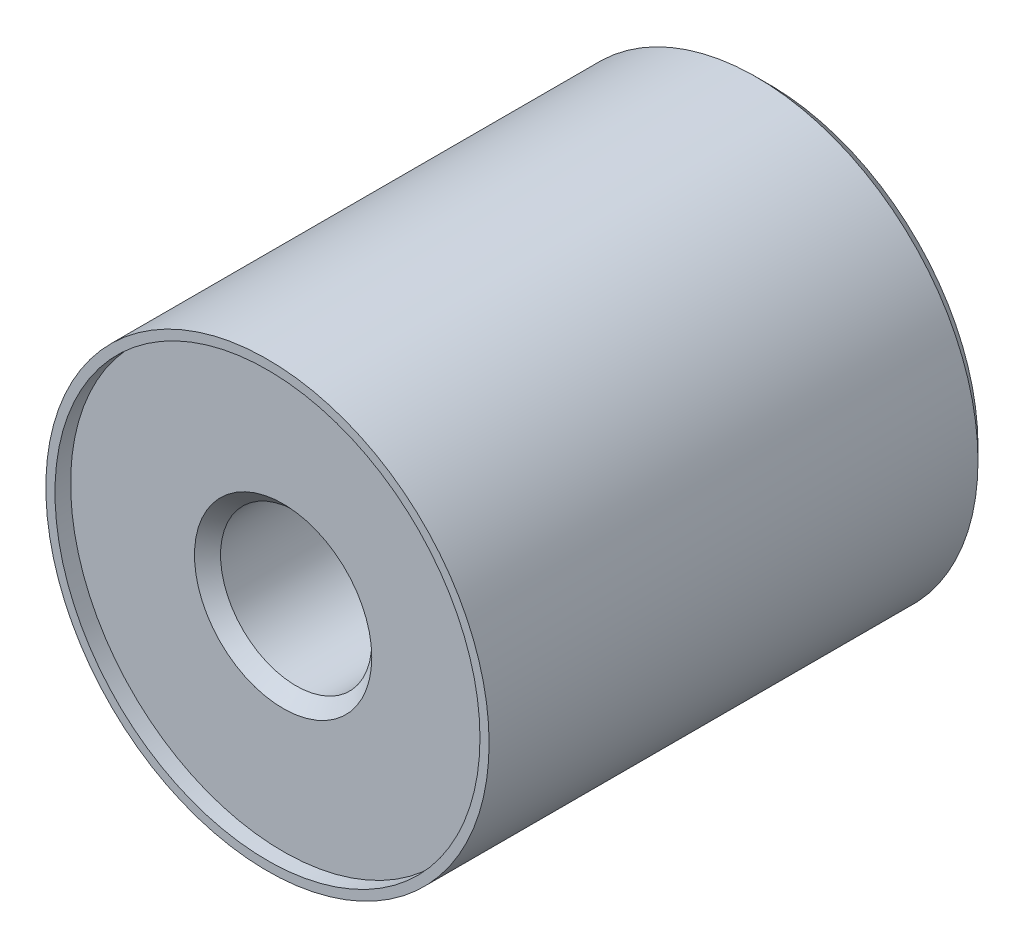
ISO-10303-21;
HEADER;
FILE_DESCRIPTION(('STEP AP214'),'2;1');
FILE_NAME('part.step','',(''),(''),'','','');
FILE_SCHEMA(('AUTOMOTIVE_DESIGN { 1 0 10303 214 1 1 1 1 }'));
ENDSEC;
DATA;
#1=APPLICATION_CONTEXT('core data for automotive mechanical design processes');
#2=APPLICATION_PROTOCOL_DEFINITION('international standard','automotive_design',2000,#1);
#3=PRODUCT_CONTEXT('',#1,'mechanical');
#4=PRODUCT('Part','Part','',(#3));
#5=PRODUCT_RELATED_PRODUCT_CATEGORY('part','',(#4));
#6=PRODUCT_DEFINITION_FORMATION('','',#4);
#7=PRODUCT_DEFINITION_CONTEXT('part definition',#1,'design');
#8=PRODUCT_DEFINITION('design','',#6,#7);
#9=PRODUCT_DEFINITION_SHAPE('','',#8);
#10=(LENGTH_UNIT() NAMED_UNIT(*) SI_UNIT(.MILLI.,.METRE.));
#11=(NAMED_UNIT(*) PLANE_ANGLE_UNIT() SI_UNIT($,.RADIAN.));
#12=(NAMED_UNIT(*) SI_UNIT($,.STERADIAN.) SOLID_ANGLE_UNIT());
#13=UNCERTAINTY_MEASURE_WITH_UNIT(LENGTH_MEASURE(1.E-05),#10,'distance_accuracy_value','');
#14=(GEOMETRIC_REPRESENTATION_CONTEXT(3) GLOBAL_UNCERTAINTY_ASSIGNED_CONTEXT((#13)) GLOBAL_UNIT_ASSIGNED_CONTEXT((#10,
#11,#12)) REPRESENTATION_CONTEXT('',''));
#15=CARTESIAN_POINT('',(0.,0.,0.));
#16=DIRECTION('',(0.,0.,1.));
#17=DIRECTION('',(1.,0.,0.));
#18=AXIS2_PLACEMENT_3D('',#15,#16,#17);
#19=CARTESIAN_POINT('',(0.,0.,18.65));
#20=DIRECTION('',(0.,0.,1.));
#21=DIRECTION('',(1.,0.,0.));
#22=AXIS2_PLACEMENT_3D('',#19,#20,#21);
#23=PLANE('',#22);
#24=CARTESIAN_POINT('',(0.,0.,18.65));
#25=DIRECTION('',(0.,0.,1.));
#26=DIRECTION('',(1.,0.,0.));
#27=AXIS2_PLACEMENT_3D('',#24,#25,#26);
#28=CIRCLE('',#27,3.4);
#29=CARTESIAN_POINT('',(3.4,0.,18.65));
#30=VERTEX_POINT('',#29);
#31=EDGE_CURVE('E10',#30,#30,#28,.F.);
#32=ORIENTED_EDGE('',*,*,#31,.T.);
#33=EDGE_LOOP('',(#32));
#34=FACE_BOUND('',#33,.T.);
#35=CARTESIAN_POINT('',(0.,0.,18.65));
#36=DIRECTION('',(0.,0.,1.));
#37=DIRECTION('',(1.,0.,0.));
#38=AXIS2_PLACEMENT_3D('',#35,#36,#37);
#39=CIRCLE('',#38,8.15);
#40=CARTESIAN_POINT('',(8.15,0.,18.65));
#41=VERTEX_POINT('',#40);
#42=EDGE_CURVE('E60',#41,#41,#39,.F.);
#43=ORIENTED_EDGE('',*,*,#42,.F.);
#44=EDGE_LOOP('',(#43));
#45=FACE_BOUND('',#44,.T.);
#46=ADVANCED_FACE('F33',(#34,#45),#23,.T.);
#47=CARTESIAN_POINT('',(0.,0.,0.));
#48=DIRECTION('',(0.,0.,1.));
#49=DIRECTION('',(1.,0.,0.));
#50=AXIS2_PLACEMENT_3D('',#47,#48,#49);
#51=PLANE('',#50);
#52=CARTESIAN_POINT('',(0.,0.,0.));
#53=DIRECTION('',(0.,0.,1.));
#54=DIRECTION('',(1.,0.,0.));
#55=AXIS2_PLACEMENT_3D('',#52,#53,#54);
#56=CIRCLE('',#55,3.4);
#57=CARTESIAN_POINT('',(3.4,0.,0.));
#58=VERTEX_POINT('',#57);
#59=EDGE_CURVE('E54',#58,#58,#56,.T.);
#60=ORIENTED_EDGE('',*,*,#59,.T.);
#61=EDGE_LOOP('',(#60));
#62=FACE_BOUND('',#61,.T.);
#63=CARTESIAN_POINT('',(0.,0.,0.));
#64=DIRECTION('',(0.,0.,1.));
#65=DIRECTION('',(1.,0.,0.));
#66=AXIS2_PLACEMENT_3D('',#63,#64,#65);
#67=CIRCLE('',#66,7.99999999999999);
#68=CARTESIAN_POINT('',(7.99999999999999,0.,0.));
#69=VERTEX_POINT('',#68);
#70=EDGE_CURVE('E57',#69,#69,#67,.F.);
#71=ORIENTED_EDGE('',*,*,#70,.T.);
#72=EDGE_LOOP('',(#71));
#73=FACE_BOUND('',#72,.T.);
#74=ADVANCED_FACE('F89',(#62,#73),#51,.F.);
#75=CARTESIAN_POINT('',(0.,0.,18.65));
#76=DIRECTION('',(0.,0.,-1.));
#77=DIRECTION('',(-1.,0.,0.));
#78=AXIS2_PLACEMENT_3D('',#75,#76,#77);
#79=CYLINDRICAL_SURFACE('',#78,8.5);
#80=CARTESIAN_POINT('',(0.,0.,0.500000000000004));
#81=DIRECTION('',(0.,0.,1.));
#82=DIRECTION('',(1.,0.,0.));
#83=AXIS2_PLACEMENT_3D('',#80,#81,#82);
#84=CIRCLE('',#83,8.5);
#85=CARTESIAN_POINT('',(8.5,0.,0.500000000000004));
#86=VERTEX_POINT('',#85);
#87=EDGE_CURVE('E41',#86,#86,#84,.T.);
#88=ORIENTED_EDGE('',*,*,#87,.T.);
#89=EDGE_LOOP('',(#88));
#90=FACE_BOUND('',#89,.T.);
#91=CARTESIAN_POINT('',(0.,0.,19.25));
#92=DIRECTION('',(0.,0.,1.));
#93=DIRECTION('',(1.,0.,0.));
#94=AXIS2_PLACEMENT_3D('',#91,#92,#93);
#95=CIRCLE('',#94,8.5);
#96=CARTESIAN_POINT('',(8.5,0.,19.25));
#97=VERTEX_POINT('',#96);
#98=EDGE_CURVE('E63',#97,#97,#95,.T.);
#99=ORIENTED_EDGE('',*,*,#98,.F.);
#100=EDGE_LOOP('',(#99));
#101=FACE_BOUND('',#100,.T.);
#102=ADVANCED_FACE('F85',(#90,#101),#79,.T.);
#103=CARTESIAN_POINT('',(0.,0.,18.65));
#104=DIRECTION('',(0.,0.,-1.));
#105=DIRECTION('',(-1.,0.,0.));
#106=AXIS2_PLACEMENT_3D('',#103,#104,#105);
#107=CYLINDRICAL_SURFACE('',#106,2.9);
#108=CARTESIAN_POINT('',(0.,0.,0.500000000000004));
#109=DIRECTION('',(0.,0.,1.));
#110=DIRECTION('',(1.,0.,0.));
#111=AXIS2_PLACEMENT_3D('',#108,#109,#110);
#112=CIRCLE('',#111,2.9);
#113=CARTESIAN_POINT('',(2.9,0.,0.500000000000004));
#114=VERTEX_POINT('',#113);
#115=EDGE_CURVE('E45',#114,#114,#112,.F.);
#116=ORIENTED_EDGE('',*,*,#115,.T.);
#117=EDGE_LOOP('',(#116));
#118=FACE_BOUND('',#117,.T.);
#119=CARTESIAN_POINT('',(0.,0.,18.15));
#120=DIRECTION('',(0.,0.,1.));
#121=DIRECTION('',(1.,0.,0.));
#122=AXIS2_PLACEMENT_3D('',#119,#120,#121);
#123=CIRCLE('',#122,2.9);
#124=CARTESIAN_POINT('',(2.9,0.,18.15));
#125=VERTEX_POINT('',#124);
#126=EDGE_CURVE('E49',#125,#125,#123,.T.);
#127=ORIENTED_EDGE('',*,*,#126,.T.);
#128=EDGE_LOOP('',(#127));
#129=FACE_BOUND('',#128,.T.);
#130=ADVANCED_FACE('F75',(#118,#129),#107,.F.);
#131=CARTESIAN_POINT('',(0.,0.,19.25));
#132=DIRECTION('',(0.,0.,1.));
#133=DIRECTION('',(1.,0.,0.));
#134=AXIS2_PLACEMENT_3D('',#131,#132,#133);
#135=PLANE('',#134);
#136=ORIENTED_EDGE('',*,*,#98,.T.);
#137=EDGE_LOOP('',(#136));
#138=FACE_BOUND('',#137,.T.);
#139=CARTESIAN_POINT('',(0.,0.,19.25));
#140=DIRECTION('',(0.,0.,1.));
#141=DIRECTION('',(1.,0.,0.));
#142=AXIS2_PLACEMENT_3D('',#139,#140,#141);
#143=CIRCLE('',#142,8.15);
#144=CARTESIAN_POINT('',(8.15,0.,19.25));
#145=VERTEX_POINT('',#144);
#146=EDGE_CURVE('E66',#145,#145,#143,.T.);
#147=ORIENTED_EDGE('',*,*,#146,.F.);
#148=EDGE_LOOP('',(#147));
#149=FACE_BOUND('',#148,.T.);
#150=ADVANCED_FACE('F73',(#138,#149),#135,.T.);
#151=CARTESIAN_POINT('',(0.,0.,19.25));
#152=DIRECTION('',(0.,0.,-1.));
#153=DIRECTION('',(-1.,0.,0.));
#154=AXIS2_PLACEMENT_3D('',#151,#152,#153);
#155=CYLINDRICAL_SURFACE('',#154,8.15);
#156=ORIENTED_EDGE('',*,*,#146,.T.);
#157=EDGE_LOOP('',(#156));
#158=FACE_BOUND('',#157,.T.);
#159=ORIENTED_EDGE('',*,*,#42,.T.);
#160=EDGE_LOOP('',(#159));
#161=FACE_BOUND('',#160,.T.);
#162=ADVANCED_FACE('F70',(#158,#161),#155,.F.);
#163=CARTESIAN_POINT('',(0.,0.,0.));
#164=DIRECTION('',(0.,0.,-1.));
#165=DIRECTION('',(-1.,0.,0.));
#166=AXIS2_PLACEMENT_3D('',#163,#164,#165);
#167=CONICAL_SURFACE('',#166,3.4,0.785398163397448);
#168=ORIENTED_EDGE('',*,*,#115,.F.);
#169=EDGE_LOOP('',(#168));
#170=FACE_BOUND('',#169,.T.);
#171=ORIENTED_EDGE('',*,*,#59,.F.);
#172=EDGE_LOOP('',(#171));
#173=FACE_BOUND('',#172,.T.);
#174=ADVANCED_FACE('F82',(#170,#173),#167,.F.);
#175=CARTESIAN_POINT('',(0.,0.,0.500000000000004));
#176=DIRECTION('',(0.,0.,1.));
#177=DIRECTION('',(1.,0.,0.));
#178=AXIS2_PLACEMENT_3D('',#175,#176,#177);
#179=CONICAL_SURFACE('',#178,8.5,0.785398163397453);
#180=ORIENTED_EDGE('',*,*,#70,.F.);
#181=EDGE_LOOP('',(#180));
#182=FACE_BOUND('',#181,.T.);
#183=ORIENTED_EDGE('',*,*,#87,.F.);
#184=EDGE_LOOP('',(#183));
#185=FACE_BOUND('',#184,.T.);
#186=ADVANCED_FACE('F106',(#182,#185),#179,.T.);
#187=CARTESIAN_POINT('',(0.,0.,18.15));
#188=DIRECTION('',(0.,0.,1.));
#189=DIRECTION('',(1.,0.,0.));
#190=AXIS2_PLACEMENT_3D('',#187,#188,#189);
#191=CONICAL_SURFACE('',#190,2.9,0.785398163397452);
#192=ORIENTED_EDGE('',*,*,#31,.F.);
#193=EDGE_LOOP('',(#192));
#194=FACE_BOUND('',#193,.T.);
#195=ORIENTED_EDGE('',*,*,#126,.F.);
#196=EDGE_LOOP('',(#195));
#197=FACE_BOUND('',#196,.T.);
#198=ADVANCED_FACE('F36',(#194,#197),#191,.F.);
#199=CLOSED_SHELL('',(#46,#74,#102,#130,#150,#162,#174,#186,#198));
#200=MANIFOLD_SOLID_BREP('B2',#199);
#201=ADVANCED_BREP_SHAPE_REPRESENTATION('',(#18,#200),#14);
#202=SHAPE_DEFINITION_REPRESENTATION(#9,#201);
ENDSEC;
END-ISO-10303-21;
